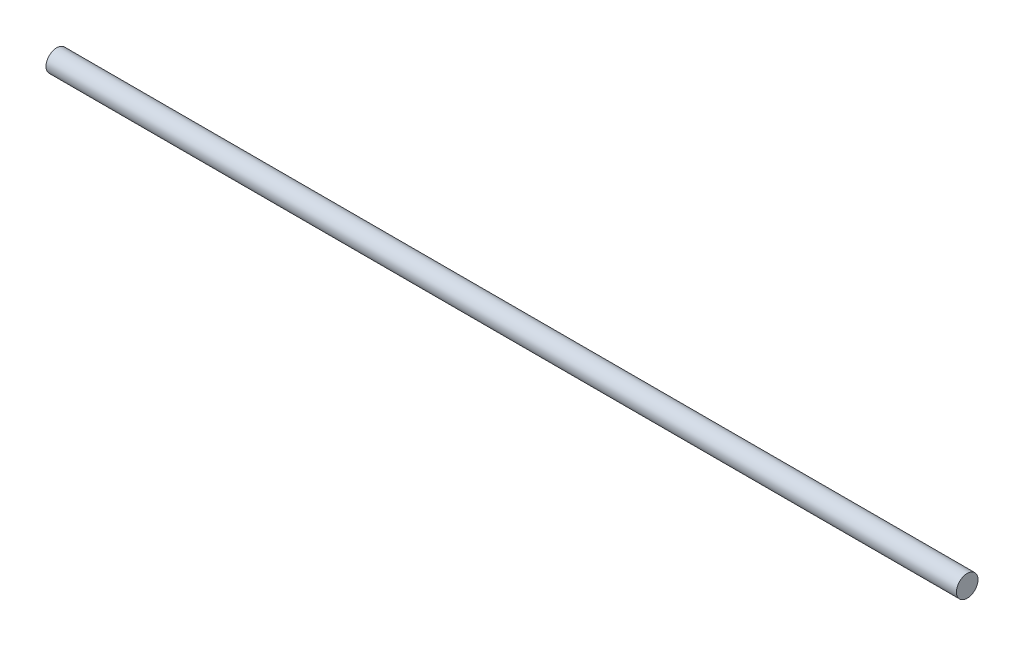
ISO-10303-21;
HEADER;
FILE_DESCRIPTION(('STEP AP214'),'2;1');
FILE_NAME('part.step','',(''),(''),'','','');
FILE_SCHEMA(('AUTOMOTIVE_DESIGN { 1 0 10303 214 1 1 1 1 }'));
ENDSEC;
DATA;
#1=APPLICATION_CONTEXT('core data for automotive mechanical design processes');
#2=APPLICATION_PROTOCOL_DEFINITION('international standard','automotive_design',2000,#1);
#3=PRODUCT_CONTEXT('',#1,'mechanical');
#4=PRODUCT('Part','Part','',(#3));
#5=PRODUCT_RELATED_PRODUCT_CATEGORY('part','',(#4));
#6=PRODUCT_DEFINITION_FORMATION('','',#4);
#7=PRODUCT_DEFINITION_CONTEXT('part definition',#1,'design');
#8=PRODUCT_DEFINITION('design','',#6,#7);
#9=PRODUCT_DEFINITION_SHAPE('','',#8);
#10=(LENGTH_UNIT() NAMED_UNIT(*) SI_UNIT(.MILLI.,.METRE.));
#11=(NAMED_UNIT(*) PLANE_ANGLE_UNIT() SI_UNIT($,.RADIAN.));
#12=(NAMED_UNIT(*) SI_UNIT($,.STERADIAN.) SOLID_ANGLE_UNIT());
#13=UNCERTAINTY_MEASURE_WITH_UNIT(LENGTH_MEASURE(1.E-05),#10,'distance_accuracy_value','');
#14=(GEOMETRIC_REPRESENTATION_CONTEXT(3) GLOBAL_UNCERTAINTY_ASSIGNED_CONTEXT((#13)) GLOBAL_UNIT_ASSIGNED_CONTEXT((#10,
#11,#12)) REPRESENTATION_CONTEXT('',''));
#15=CARTESIAN_POINT('',(0.,0.,0.));
#16=DIRECTION('',(0.,0.,1.));
#17=DIRECTION('',(1.,0.,0.));
#18=AXIS2_PLACEMENT_3D('',#15,#16,#17);
#19=CARTESIAN_POINT('',(-268.,6.34999999999999,0.));
#20=DIRECTION('',(1.,0.,0.));
#21=DIRECTION('',(0.,0.,-1.));
#22=AXIS2_PLACEMENT_3D('',#19,#20,#21);
#23=PLANE('',#22);
#24=CARTESIAN_POINT('',(-268.,0.,0.));
#25=DIRECTION('',(-1.,0.,0.));
#26=DIRECTION('',(0.,0.,1.));
#27=AXIS2_PLACEMENT_3D('',#24,#25,#26);
#28=CIRCLE('',#27,6.34999999999999);
#29=CARTESIAN_POINT('',(-268.,0.,6.34999999999999));
#30=VERTEX_POINT('',#29);
#31=EDGE_CURVE('E10',#30,#30,#28,.T.);
#32=ORIENTED_EDGE('',*,*,#31,.T.);
#33=EDGE_LOOP('',(#32));
#34=FACE_BOUND('',#33,.T.);
#35=ADVANCED_FACE('F49',(#34),#23,.F.);
#36=CARTESIAN_POINT('',(0.,0.,0.));
#37=DIRECTION('',(-1.,0.,0.));
#38=DIRECTION('',(0.,0.,1.));
#39=AXIS2_PLACEMENT_3D('',#36,#37,#38);
#40=CYLINDRICAL_SURFACE('',#39,6.35000000000003);
#41=ORIENTED_EDGE('',*,*,#31,.F.);
#42=EDGE_LOOP('',(#41));
#43=FACE_BOUND('',#42,.T.);
#44=CARTESIAN_POINT('',(268.,0.,0.));
#45=DIRECTION('',(-1.,0.,0.));
#46=DIRECTION('',(0.,0.,1.));
#47=AXIS2_PLACEMENT_3D('',#44,#45,#46);
#48=CIRCLE('',#47,6.35000000000006);
#49=CARTESIAN_POINT('',(268.,0.,6.35000000000006));
#50=VERTEX_POINT('',#49);
#51=EDGE_CURVE('E55',#50,#50,#48,.T.);
#52=ORIENTED_EDGE('',*,*,#51,.T.);
#53=EDGE_LOOP('',(#52));
#54=FACE_BOUND('',#53,.T.);
#55=ADVANCED_FACE('F61',(#43,#54),#40,.T.);
#56=CARTESIAN_POINT('',(268.,6.35000000000006,0.));
#57=DIRECTION('',(-1.,0.,0.));
#58=DIRECTION('',(0.,0.,1.));
#59=AXIS2_PLACEMENT_3D('',#56,#57,#58);
#60=PLANE('',#59);
#61=ORIENTED_EDGE('',*,*,#51,.F.);
#62=EDGE_LOOP('',(#61));
#63=FACE_BOUND('',#62,.T.);
#64=ADVANCED_FACE('F63',(#63),#60,.F.);
#65=CLOSED_SHELL('',(#35,#55,#64));
#66=MANIFOLD_SOLID_BREP('B2',#65);
#67=ADVANCED_BREP_SHAPE_REPRESENTATION('',(#18,#66),#14);
#68=SHAPE_DEFINITION_REPRESENTATION(#9,#67);
ENDSEC;
END-ISO-10303-21;
